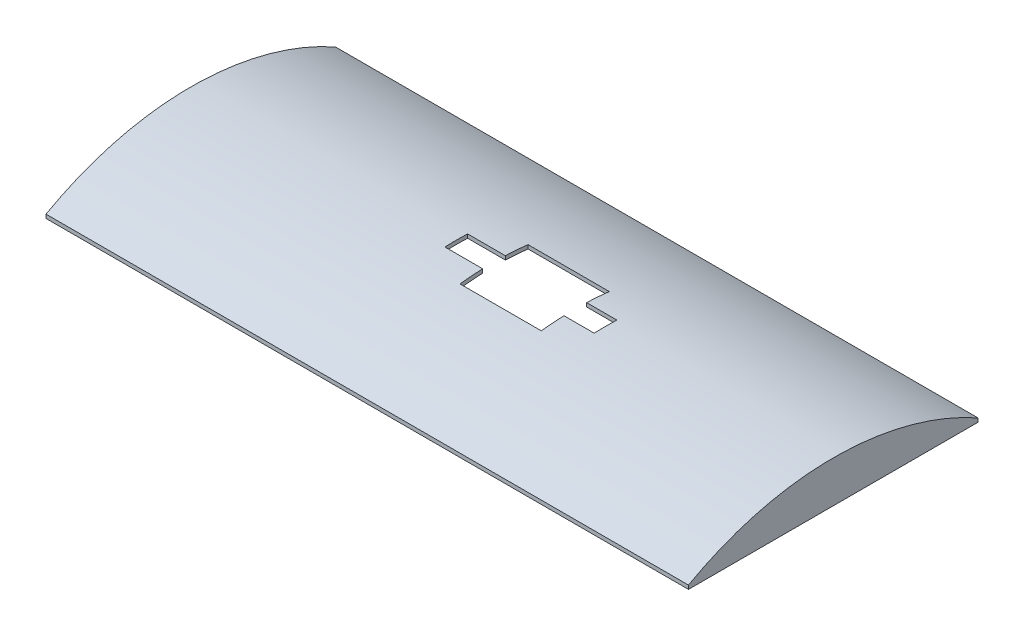
ISO-10303-21;
HEADER;
FILE_DESCRIPTION(('STEP AP214'),'2;1');
FILE_NAME('part.step','',(''),(''),'','','');
FILE_SCHEMA(('AUTOMOTIVE_DESIGN { 1 0 10303 214 1 1 1 1 }'));
ENDSEC;
DATA;
#1=APPLICATION_CONTEXT('core data for automotive mechanical design processes');
#2=APPLICATION_PROTOCOL_DEFINITION('international standard','automotive_design',2000,#1);
#3=PRODUCT_CONTEXT('',#1,'mechanical');
#4=PRODUCT('Part','Part','',(#3));
#5=PRODUCT_RELATED_PRODUCT_CATEGORY('part','',(#4));
#6=PRODUCT_DEFINITION_FORMATION('','',#4);
#7=PRODUCT_DEFINITION_CONTEXT('part definition',#1,'design');
#8=PRODUCT_DEFINITION('design','',#6,#7);
#9=PRODUCT_DEFINITION_SHAPE('','',#8);
#10=(LENGTH_UNIT() NAMED_UNIT(*) SI_UNIT(.MILLI.,.METRE.));
#11=(NAMED_UNIT(*) PLANE_ANGLE_UNIT() SI_UNIT($,.RADIAN.));
#12=(NAMED_UNIT(*) SI_UNIT($,.STERADIAN.) SOLID_ANGLE_UNIT());
#13=UNCERTAINTY_MEASURE_WITH_UNIT(LENGTH_MEASURE(1.E-05),#10,'distance_accuracy_value','');
#14=(GEOMETRIC_REPRESENTATION_CONTEXT(3) GLOBAL_UNCERTAINTY_ASSIGNED_CONTEXT((#13)) GLOBAL_UNIT_ASSIGNED_CONTEXT((#10,
#11,#12)) REPRESENTATION_CONTEXT('',''));
#15=CARTESIAN_POINT('',(0.,0.,0.));
#16=DIRECTION('',(0.,0.,1.));
#17=DIRECTION('',(1.,0.,0.));
#18=AXIS2_PLACEMENT_3D('',#15,#16,#17);
#19=CARTESIAN_POINT('',(-50.,-78.359,3.874307259704E-13));
#20=DIRECTION('',(1.,0.,0.));
#21=DIRECTION('',(0.,0.,-1.));
#22=AXIS2_PLACEMENT_3D('',#19,#20,#21);
#23=CYLINDRICAL_SURFACE('',#22,78.359);
#24=DIRECTION('',(1.,0.,0.));
#25=VECTOR('',#24,1.);
#26=CARTESIAN_POINT('',(-50.,-9.99999999999999,38.3037857136859));
#27=LINE('',#26,#25);
#28=CARTESIAN_POINT('',(-50.,-9.99999999999999,38.3037857136859));
#29=VERTEX_POINT('',#28);
#30=CARTESIAN_POINT('',(120.,-9.99999999999999,38.3037857136859));
#31=VERTEX_POINT('',#30);
#32=EDGE_CURVE('E179',#29,#31,#27,.T.);
#33=ORIENTED_EDGE('',*,*,#32,.T.);
#34=CARTESIAN_POINT('',(120.,-78.359,3.874307259704E-13));
#35=DIRECTION('',(-1.,0.,0.));
#36=DIRECTION('',(0.,0.,1.));
#37=AXIS2_PLACEMENT_3D('',#34,#35,#36);
#38=CIRCLE('',#37,78.359);
#39=CARTESIAN_POINT('',(120.,-9.99999999999999,-38.3037857136859));
#40=VERTEX_POINT('',#39);
#41=EDGE_CURVE('E224',#31,#40,#38,.T.);
#42=ORIENTED_EDGE('',*,*,#41,.T.);
#43=DIRECTION('',(1.,0.,0.));
#44=VECTOR('',#43,1.);
#45=CARTESIAN_POINT('',(-50.,-9.99999999999999,-38.3037857136859));
#46=LINE('',#45,#44);
#47=CARTESIAN_POINT('',(-50.,-9.99999999999999,-38.3037857136859));
#48=VERTEX_POINT('',#47);
#49=EDGE_CURVE('E219',#48,#40,#46,.T.);
#50=ORIENTED_EDGE('',*,*,#49,.F.);
#51=CARTESIAN_POINT('',(-50.,-78.359,3.874307259704E-13));
#52=DIRECTION('',(-1.,0.,0.));
#53=DIRECTION('',(0.,0.,1.));
#54=AXIS2_PLACEMENT_3D('',#51,#52,#53);
#55=CIRCLE('',#54,78.359);
#56=EDGE_CURVE('E222',#29,#48,#55,.T.);
#57=ORIENTED_EDGE('',*,*,#56,.F.);
#58=EDGE_LOOP('',(#33,#42,#50,#57));
#59=FACE_BOUND('',#58,.T.);
#60=CARTESIAN_POINT('',(20.25,-78.359,3.874307259704E-13));
#61=DIRECTION('',(1.,0.,0.));
#62=DIRECTION('',(0.,0.,-1.));
#63=AXIS2_PLACEMENT_3D('',#60,#61,#62);
#64=CIRCLE('',#63,78.359);
#65=CARTESIAN_POINT('',(20.25,-0.0574490511203313,-2.99999999999993));
#66=VERTEX_POINT('',#65);
#67=CARTESIAN_POINT('',(20.25,-0.0574490511203174,3.00000000000007));
#68=VERTEX_POINT('',#67);
#69=EDGE_CURVE('E298',#66,#68,#64,.T.);
#70=ORIENTED_EDGE('',*,*,#69,.F.);
#71=DIRECTION('',(1.,0.,0.));
#72=VECTOR('',#71,1.);
#73=CARTESIAN_POINT('',(-50.,-0.0574490511203313,-2.99999999999993));
#74=LINE('',#73,#72);
#75=CARTESIAN_POINT('',(30.25,-0.0574490511203313,-2.99999999999993));
#76=VERTEX_POINT('',#75);
#77=EDGE_CURVE('E300',#76,#66,#74,.F.);
#78=ORIENTED_EDGE('',*,*,#77,.F.);
#79=CARTESIAN_POINT('',(30.25,-78.359,3.874307259704E-13));
#80=DIRECTION('',(-1.,0.,0.));
#81=DIRECTION('',(0.,0.,1.));
#82=AXIS2_PLACEMENT_3D('',#79,#80,#81);
#83=CIRCLE('',#82,78.359);
#84=CARTESIAN_POINT('',(30.25,-0.518567826225461,-8.99999999999993));
#85=VERTEX_POINT('',#84);
#86=EDGE_CURVE('E302',#76,#85,#83,.T.);
#87=ORIENTED_EDGE('',*,*,#86,.T.);
#88=DIRECTION('',(1.,0.,0.));
#89=VECTOR('',#88,1.);
#90=CARTESIAN_POINT('',(-50.,-0.518567826225461,-8.99999999999993));
#91=LINE('',#90,#89);
#92=CARTESIAN_POINT('',(51.75,-0.518567826225461,-8.99999999999994));
#93=VERTEX_POINT('',#92);
#94=EDGE_CURVE('E186',#93,#85,#91,.F.);
#95=ORIENTED_EDGE('',*,*,#94,.F.);
#96=CARTESIAN_POINT('',(51.75,-78.359,3.874307259704E-13));
#97=DIRECTION('',(-1.,0.,0.));
#98=DIRECTION('',(0.,0.,1.));
#99=AXIS2_PLACEMENT_3D('',#96,#97,#98);
#100=CIRCLE('',#99,78.359);
#101=CARTESIAN_POINT('',(51.75,-0.0574490511203313,-2.99999999999994));
#102=VERTEX_POINT('',#101);
#103=EDGE_CURVE('E277',#102,#93,#100,.T.);
#104=ORIENTED_EDGE('',*,*,#103,.F.);
#105=DIRECTION('',(1.,0.,0.));
#106=VECTOR('',#105,1.);
#107=CARTESIAN_POINT('',(-50.,-0.0574490511203313,-2.99999999999994));
#108=LINE('',#107,#106);
#109=CARTESIAN_POINT('',(59.75,-0.0574490511203313,-2.99999999999994));
#110=VERTEX_POINT('',#109);
#111=EDGE_CURVE('E279',#102,#110,#108,.T.);
#112=ORIENTED_EDGE('',*,*,#111,.T.);
#113=CARTESIAN_POINT('',(59.75,-78.359,3.874307259704E-13));
#114=DIRECTION('',(1.,0.,0.));
#115=DIRECTION('',(0.,0.,-1.));
#116=AXIS2_PLACEMENT_3D('',#113,#114,#115);
#117=CIRCLE('',#116,78.359);
#118=CARTESIAN_POINT('',(59.75,-0.0574490511203174,3.00000000000006));
#119=VERTEX_POINT('',#118);
#120=EDGE_CURVE('E282',#110,#119,#117,.T.);
#121=ORIENTED_EDGE('',*,*,#120,.T.);
#122=DIRECTION('',(1.,0.,0.));
#123=VECTOR('',#122,1.);
#124=CARTESIAN_POINT('',(-50.,-0.0574490511203174,3.00000000000006));
#125=LINE('',#124,#123);
#126=CARTESIAN_POINT('',(51.75,-0.0574490511203174,3.00000000000006));
#127=VERTEX_POINT('',#126);
#128=EDGE_CURVE('E284',#127,#119,#125,.T.);
#129=ORIENTED_EDGE('',*,*,#128,.F.);
#130=CARTESIAN_POINT('',(51.75,-78.359,3.874307259704E-13));
#131=DIRECTION('',(-1.,0.,0.));
#132=DIRECTION('',(0.,0.,1.));
#133=AXIS2_PLACEMENT_3D('',#130,#131,#132);
#134=CIRCLE('',#133,78.359);
#135=CARTESIAN_POINT('',(51.75,-0.518567826225391,9.00000000000006));
#136=VERTEX_POINT('',#135);
#137=EDGE_CURVE('E287',#136,#127,#134,.T.);
#138=ORIENTED_EDGE('',*,*,#137,.F.);
#139=DIRECTION('',(1.,0.,0.));
#140=VECTOR('',#139,1.);
#141=CARTESIAN_POINT('',(-50.,-0.518567826225391,9.00000000000007));
#142=LINE('',#141,#140);
#143=CARTESIAN_POINT('',(30.25,-0.518567826225391,9.00000000000007));
#144=VERTEX_POINT('',#143);
#145=EDGE_CURVE('E289',#136,#144,#142,.F.);
#146=ORIENTED_EDGE('',*,*,#145,.T.);
#147=CARTESIAN_POINT('',(30.25,-78.359,3.874307259704E-13));
#148=DIRECTION('',(-1.,0.,0.));
#149=DIRECTION('',(0.,0.,1.));
#150=AXIS2_PLACEMENT_3D('',#147,#148,#149);
#151=CIRCLE('',#150,78.359);
#152=CARTESIAN_POINT('',(30.25,-0.0574490511203174,3.00000000000007));
#153=VERTEX_POINT('',#152);
#154=EDGE_CURVE('E292',#144,#153,#151,.T.);
#155=ORIENTED_EDGE('',*,*,#154,.T.);
#156=DIRECTION('',(1.,0.,0.));
#157=VECTOR('',#156,1.);
#158=CARTESIAN_POINT('',(-50.,-0.0574490511203174,3.00000000000007));
#159=LINE('',#158,#157);
#160=EDGE_CURVE('E295',#153,#68,#159,.F.);
#161=ORIENTED_EDGE('',*,*,#160,.T.);
#162=EDGE_LOOP('',(#70,#78,#87,#95,#104,#112,#121,#129,#138,#146,#155,#161));
#163=FACE_BOUND('',#162,.T.);
#164=ADVANCED_FACE('F41',(#59,#163),#23,.T.);
#165=CARTESIAN_POINT('',(-50.,-78.359,3.874307259704E-13));
#166=DIRECTION('',(1.,0.,0.));
#167=DIRECTION('',(0.,0.,-1.));
#168=AXIS2_PLACEMENT_3D('',#165,#166,#167);
#169=CYLINDRICAL_SURFACE('',#168,77.359);
#170=DIRECTION('',(1.,0.,0.));
#171=VECTOR('',#170,1.);
#172=CARTESIAN_POINT('',(-49.,-9.99999999999999,36.2141132709338));
#173=LINE('',#172,#171);
#174=CARTESIAN_POINT('',(-49.,-9.99999999999999,36.2141132709338));
#175=VERTEX_POINT('',#174);
#176=CARTESIAN_POINT('',(119.,-9.99999999999999,36.2141132709338));
#177=VERTEX_POINT('',#176);
#178=EDGE_CURVE('E226',#175,#177,#173,.T.);
#179=ORIENTED_EDGE('',*,*,#178,.F.);
#180=CARTESIAN_POINT('',(-49.,-78.359,3.874307259704E-13));
#181=DIRECTION('',(-1.,0.,0.));
#182=DIRECTION('',(0.,0.,1.));
#183=AXIS2_PLACEMENT_3D('',#180,#181,#182);
#184=CIRCLE('',#183,77.359);
#185=CARTESIAN_POINT('',(-49.,-9.99999999999999,-36.2141132709331));
#186=VERTEX_POINT('',#185);
#187=EDGE_CURVE('E230',#175,#186,#184,.T.);
#188=ORIENTED_EDGE('',*,*,#187,.T.);
#189=DIRECTION('',(1.,0.,0.));
#190=VECTOR('',#189,1.);
#191=CARTESIAN_POINT('',(-49.,-9.99999999999999,-36.2141132709331));
#192=LINE('',#191,#190);
#193=CARTESIAN_POINT('',(119.,-9.99999999999999,-36.2141132709331));
#194=VERTEX_POINT('',#193);
#195=EDGE_CURVE('E227',#186,#194,#192,.T.);
#196=ORIENTED_EDGE('',*,*,#195,.T.);
#197=CARTESIAN_POINT('',(119.,-78.359,3.874307259704E-13));
#198=DIRECTION('',(-1.,0.,0.));
#199=DIRECTION('',(0.,0.,1.));
#200=AXIS2_PLACEMENT_3D('',#197,#198,#199);
#201=CIRCLE('',#200,77.359);
#202=EDGE_CURVE('E235',#177,#194,#201,.T.);
#203=ORIENTED_EDGE('',*,*,#202,.F.);
#204=EDGE_LOOP('',(#179,#188,#196,#203));
#205=FACE_BOUND('',#204,.T.);
#206=CARTESIAN_POINT('',(51.75,-78.359,3.874307259704E-13));
#207=DIRECTION('',(-1.,0.,0.));
#208=DIRECTION('',(0.,0.,1.));
#209=AXIS2_PLACEMENT_3D('',#206,#207,#208);
#210=CIRCLE('',#209,77.359);
#211=CARTESIAN_POINT('',(51.75,-1.05819223578579,-2.99999999999995));
#212=VERTEX_POINT('',#211);
#213=CARTESIAN_POINT('',(51.75,-1.52531675495444,-8.99999999999994));
#214=VERTEX_POINT('',#213);
#215=EDGE_CURVE('E48',#212,#214,#210,.T.);
#216=ORIENTED_EDGE('',*,*,#215,.T.);
#217=DIRECTION('',(1.,0.,0.));
#218=VECTOR('',#217,1.);
#219=CARTESIAN_POINT('',(-50.,-1.52531675495444,-8.99999999999994));
#220=LINE('',#219,#218);
#221=CARTESIAN_POINT('',(30.25,-1.52531675495444,-8.99999999999994));
#222=VERTEX_POINT('',#221);
#223=EDGE_CURVE('E11',#214,#222,#220,.F.);
#224=ORIENTED_EDGE('',*,*,#223,.T.);
#225=CARTESIAN_POINT('',(30.25,-78.359,3.874307259704E-13));
#226=DIRECTION('',(-1.,0.,0.));
#227=DIRECTION('',(0.,0.,1.));
#228=AXIS2_PLACEMENT_3D('',#225,#226,#227);
#229=CIRCLE('',#228,77.359);
#230=CARTESIAN_POINT('',(30.25,-1.05819223578579,-2.99999999999993));
#231=VERTEX_POINT('',#230);
#232=EDGE_CURVE('E174',#231,#222,#229,.T.);
#233=ORIENTED_EDGE('',*,*,#232,.F.);
#234=DIRECTION('',(1.,0.,0.));
#235=VECTOR('',#234,1.);
#236=CARTESIAN_POINT('',(-50.,-1.05819223578579,-2.99999999999993));
#237=LINE('',#236,#235);
#238=CARTESIAN_POINT('',(20.25,-1.05819223578579,-2.99999999999993));
#239=VERTEX_POINT('',#238);
#240=EDGE_CURVE('E178',#231,#239,#237,.F.);
#241=ORIENTED_EDGE('',*,*,#240,.T.);
#242=CARTESIAN_POINT('',(20.25,-78.359,3.874307259704E-13));
#243=DIRECTION('',(1.,0.,0.));
#244=DIRECTION('',(0.,0.,-1.));
#245=AXIS2_PLACEMENT_3D('',#242,#243,#244);
#246=CIRCLE('',#245,77.359);
#247=CARTESIAN_POINT('',(20.25,-1.05819223578578,3.00000000000007));
#248=VERTEX_POINT('',#247);
#249=EDGE_CURVE('E213',#239,#248,#246,.T.);
#250=ORIENTED_EDGE('',*,*,#249,.T.);
#251=DIRECTION('',(1.,0.,0.));
#252=VECTOR('',#251,1.);
#253=CARTESIAN_POINT('',(-50.,-1.05819223578578,3.00000000000007));
#254=LINE('',#253,#252);
#255=CARTESIAN_POINT('',(30.25,-1.05819223578578,3.00000000000007));
#256=VERTEX_POINT('',#255);
#257=EDGE_CURVE('E211',#256,#248,#254,.F.);
#258=ORIENTED_EDGE('',*,*,#257,.F.);
#259=CARTESIAN_POINT('',(30.25,-78.359,3.874307259704E-13));
#260=DIRECTION('',(-1.,0.,0.));
#261=DIRECTION('',(0.,0.,1.));
#262=AXIS2_PLACEMENT_3D('',#259,#260,#261);
#263=CIRCLE('',#262,77.359);
#264=CARTESIAN_POINT('',(30.25,-1.52531675495438,9.00000000000006));
#265=VERTEX_POINT('',#264);
#266=EDGE_CURVE('E209',#265,#256,#263,.T.);
#267=ORIENTED_EDGE('',*,*,#266,.F.);
#268=DIRECTION('',(1.,0.,0.));
#269=VECTOR('',#268,1.);
#270=CARTESIAN_POINT('',(-50.,-1.52531675495438,9.00000000000006));
#271=LINE('',#270,#269);
#272=CARTESIAN_POINT('',(51.75,-1.52531675495438,9.00000000000005));
#273=VERTEX_POINT('',#272);
#274=EDGE_CURVE('E207',#273,#265,#271,.F.);
#275=ORIENTED_EDGE('',*,*,#274,.F.);
#276=CARTESIAN_POINT('',(51.75,-78.359,3.874307259704E-13));
#277=DIRECTION('',(-1.,0.,0.));
#278=DIRECTION('',(0.,0.,1.));
#279=AXIS2_PLACEMENT_3D('',#276,#277,#278);
#280=CIRCLE('',#279,77.359);
#281=CARTESIAN_POINT('',(51.75,-1.05819223578578,3.00000000000005));
#282=VERTEX_POINT('',#281);
#283=EDGE_CURVE('E204',#273,#282,#280,.T.);
#284=ORIENTED_EDGE('',*,*,#283,.T.);
#285=DIRECTION('',(1.,0.,0.));
#286=VECTOR('',#285,1.);
#287=CARTESIAN_POINT('',(-50.,-1.05819223578578,3.00000000000005));
#288=LINE('',#287,#286);
#289=CARTESIAN_POINT('',(59.75,-1.05819223578578,3.00000000000005));
#290=VERTEX_POINT('',#289);
#291=EDGE_CURVE('E201',#282,#290,#288,.T.);
#292=ORIENTED_EDGE('',*,*,#291,.T.);
#293=CARTESIAN_POINT('',(59.75,-78.359,3.874307259704E-13));
#294=DIRECTION('',(1.,0.,0.));
#295=DIRECTION('',(0.,0.,-1.));
#296=AXIS2_PLACEMENT_3D('',#293,#294,#295);
#297=CIRCLE('',#296,77.359);
#298=CARTESIAN_POINT('',(59.75,-1.05819223578579,-2.99999999999995));
#299=VERTEX_POINT('',#298);
#300=EDGE_CURVE('E197',#299,#290,#297,.T.);
#301=ORIENTED_EDGE('',*,*,#300,.F.);
#302=DIRECTION('',(1.,0.,0.));
#303=VECTOR('',#302,1.);
#304=CARTESIAN_POINT('',(-50.,-1.05819223578579,-2.99999999999995));
#305=LINE('',#304,#303);
#306=EDGE_CURVE('E193',#212,#299,#305,.T.);
#307=ORIENTED_EDGE('',*,*,#306,.F.);
#308=EDGE_LOOP('',(#216,#224,#233,#241,#250,#258,#267,#275,#284,#292,#301,#307));
#309=FACE_BOUND('',#308,.T.);
#310=ADVANCED_FACE('F190',(#205,#309),#169,.F.);
#311=CARTESIAN_POINT('',(-50.,0.,0.));
#312=DIRECTION('',(-1.,0.,0.));
#313=DIRECTION('',(0.,0.,1.));
#314=AXIS2_PLACEMENT_3D('',#311,#312,#313);
#315=PLANE('',#314);
#316=DIRECTION('',(0.,1.,0.));
#317=VECTOR('',#316,1.);
#318=CARTESIAN_POINT('',(-50.,-11.,-38.3037857136859));
#319=LINE('',#318,#317);
#320=CARTESIAN_POINT('',(-50.,-11.,-38.3037857136859));
#321=VERTEX_POINT('',#320);
#322=EDGE_CURVE('E238',#321,#48,#319,.T.);
#323=ORIENTED_EDGE('',*,*,#322,.F.);
#324=DIRECTION('',(0.,0.,-1.));
#325=VECTOR('',#324,1.);
#326=CARTESIAN_POINT('',(-50.,-11.,0.));
#327=LINE('',#326,#325);
#328=CARTESIAN_POINT('',(-50.,-11.,38.3037857136859));
#329=VERTEX_POINT('',#328);
#330=EDGE_CURVE('E265',#329,#321,#327,.T.);
#331=ORIENTED_EDGE('',*,*,#330,.F.);
#332=DIRECTION('',(0.,1.,0.));
#333=VECTOR('',#332,1.);
#334=CARTESIAN_POINT('',(-50.,-11.,38.3037857136859));
#335=LINE('',#334,#333);
#336=EDGE_CURVE('E241',#329,#29,#335,.T.);
#337=ORIENTED_EDGE('',*,*,#336,.T.);
#338=ORIENTED_EDGE('',*,*,#56,.T.);
#339=EDGE_LOOP('',(#323,#331,#337,#338));
#340=FACE_BOUND('',#339,.T.);
#341=ADVANCED_FACE('F383',(#340),#315,.T.);
#342=CARTESIAN_POINT('',(120.,0.,0.));
#343=DIRECTION('',(-1.,0.,0.));
#344=DIRECTION('',(0.,0.,1.));
#345=AXIS2_PLACEMENT_3D('',#342,#343,#344);
#346=PLANE('',#345);
#347=DIRECTION('',(0.,1.,0.));
#348=VECTOR('',#347,1.);
#349=CARTESIAN_POINT('',(120.,-11.,38.3037857136859));
#350=LINE('',#349,#348);
#351=CARTESIAN_POINT('',(120.,-11.,38.3037857136859));
#352=VERTEX_POINT('',#351);
#353=EDGE_CURVE('E255',#352,#31,#350,.T.);
#354=ORIENTED_EDGE('',*,*,#353,.F.);
#355=DIRECTION('',(0.,0.,1.));
#356=VECTOR('',#355,1.);
#357=CARTESIAN_POINT('',(120.,-11.,0.));
#358=LINE('',#357,#356);
#359=CARTESIAN_POINT('',(120.,-11.,-38.3037857136859));
#360=VERTEX_POINT('',#359);
#361=EDGE_CURVE('E261',#360,#352,#358,.T.);
#362=ORIENTED_EDGE('',*,*,#361,.F.);
#363=DIRECTION('',(0.,1.,0.));
#364=VECTOR('',#363,1.);
#365=CARTESIAN_POINT('',(120.,-11.,-38.3037857136859));
#366=LINE('',#365,#364);
#367=EDGE_CURVE('E252',#360,#40,#366,.T.);
#368=ORIENTED_EDGE('',*,*,#367,.T.);
#369=ORIENTED_EDGE('',*,*,#41,.F.);
#370=EDGE_LOOP('',(#354,#362,#368,#369));
#371=FACE_BOUND('',#370,.T.);
#372=ADVANCED_FACE('F395',(#371),#346,.F.);
#373=CARTESIAN_POINT('',(0.,-11.,-38.3037857136859));
#374=DIRECTION('',(0.,0.,1.));
#375=DIRECTION('',(1.,0.,0.));
#376=AXIS2_PLACEMENT_3D('',#373,#374,#375);
#377=PLANE('',#376);
#378=ORIENTED_EDGE('',*,*,#49,.T.);
#379=ORIENTED_EDGE('',*,*,#367,.F.);
#380=DIRECTION('',(1.,0.,0.));
#381=VECTOR('',#380,1.);
#382=CARTESIAN_POINT('',(0.,-11.,-38.3037857136859));
#383=LINE('',#382,#381);
#384=EDGE_CURVE('E263',#321,#360,#383,.T.);
#385=ORIENTED_EDGE('',*,*,#384,.F.);
#386=ORIENTED_EDGE('',*,*,#322,.T.);
#387=EDGE_LOOP('',(#378,#379,#385,#386));
#388=FACE_BOUND('',#387,.T.);
#389=ADVANCED_FACE('F399',(#388),#377,.F.);
#390=CARTESIAN_POINT('',(0.,-11.,-36.2141132709331));
#391=DIRECTION('',(0.,0.,-1.));
#392=DIRECTION('',(-1.,0.,0.));
#393=AXIS2_PLACEMENT_3D('',#390,#391,#392);
#394=PLANE('',#393);
#395=ORIENTED_EDGE('',*,*,#195,.F.);
#396=DIRECTION('',(0.,1.,0.));
#397=VECTOR('',#396,1.);
#398=CARTESIAN_POINT('',(-49.,-11.,-36.2141132709331));
#399=LINE('',#398,#397);
#400=CARTESIAN_POINT('',(-49.,-11.,-36.2141132709331));
#401=VERTEX_POINT('',#400);
#402=EDGE_CURVE('E242',#401,#186,#399,.T.);
#403=ORIENTED_EDGE('',*,*,#402,.F.);
#404=DIRECTION('',(-1.,0.,0.));
#405=VECTOR('',#404,1.);
#406=CARTESIAN_POINT('',(0.,-11.,-36.2141132709331));
#407=LINE('',#406,#405);
#408=CARTESIAN_POINT('',(119.,-11.,-36.2141132709331));
#409=VERTEX_POINT('',#408);
#410=EDGE_CURVE('E271',#409,#401,#407,.T.);
#411=ORIENTED_EDGE('',*,*,#410,.F.);
#412=DIRECTION('',(0.,1.,0.));
#413=VECTOR('',#412,1.);
#414=CARTESIAN_POINT('',(119.,-11.,-36.2141132709331));
#415=LINE('',#414,#413);
#416=EDGE_CURVE('E239',#409,#194,#415,.T.);
#417=ORIENTED_EDGE('',*,*,#416,.T.);
#418=EDGE_LOOP('',(#395,#403,#411,#417));
#419=FACE_BOUND('',#418,.T.);
#420=ADVANCED_FACE('F420',(#419),#394,.F.);
#421=CARTESIAN_POINT('',(0.,-11.,36.2141132709338));
#422=DIRECTION('',(0.,0.,1.));
#423=DIRECTION('',(1.,0.,0.));
#424=AXIS2_PLACEMENT_3D('',#421,#422,#423);
#425=PLANE('',#424);
#426=ORIENTED_EDGE('',*,*,#178,.T.);
#427=DIRECTION('',(0.,1.,0.));
#428=VECTOR('',#427,1.);
#429=CARTESIAN_POINT('',(119.,-11.,36.2141132709338));
#430=LINE('',#429,#428);
#431=CARTESIAN_POINT('',(119.,-11.,36.2141132709338));
#432=VERTEX_POINT('',#431);
#433=EDGE_CURVE('E247',#432,#177,#430,.T.);
#434=ORIENTED_EDGE('',*,*,#433,.F.);
#435=DIRECTION('',(1.,0.,0.));
#436=VECTOR('',#435,1.);
#437=CARTESIAN_POINT('',(0.,-11.,36.2141132709338));
#438=LINE('',#437,#436);
#439=CARTESIAN_POINT('',(-49.,-11.,36.2141132709338));
#440=VERTEX_POINT('',#439);
#441=EDGE_CURVE('E267',#440,#432,#438,.T.);
#442=ORIENTED_EDGE('',*,*,#441,.F.);
#443=DIRECTION('',(0.,1.,0.));
#444=VECTOR('',#443,1.);
#445=CARTESIAN_POINT('',(-49.,-11.,36.2141132709338));
#446=LINE('',#445,#444);
#447=EDGE_CURVE('E245',#440,#175,#446,.T.);
#448=ORIENTED_EDGE('',*,*,#447,.T.);
#449=EDGE_LOOP('',(#426,#434,#442,#448));
#450=FACE_BOUND('',#449,.T.);
#451=ADVANCED_FACE('F415',(#450),#425,.F.);
#452=CARTESIAN_POINT('',(0.,-11.,38.3037857136859));
#453=DIRECTION('',(0.,0.,-1.));
#454=DIRECTION('',(-1.,0.,0.));
#455=AXIS2_PLACEMENT_3D('',#452,#453,#454);
#456=PLANE('',#455);
#457=ORIENTED_EDGE('',*,*,#32,.F.);
#458=ORIENTED_EDGE('',*,*,#336,.F.);
#459=DIRECTION('',(-1.,0.,0.));
#460=VECTOR('',#459,1.);
#461=CARTESIAN_POINT('',(0.,-11.,38.3037857136859));
#462=LINE('',#461,#460);
#463=EDGE_CURVE('E249',#352,#329,#462,.T.);
#464=ORIENTED_EDGE('',*,*,#463,.F.);
#465=ORIENTED_EDGE('',*,*,#353,.T.);
#466=EDGE_LOOP('',(#457,#458,#464,#465));
#467=FACE_BOUND('',#466,.T.);
#468=ADVANCED_FACE('F392',(#467),#456,.F.);
#469=CARTESIAN_POINT('',(0.,-11.,0.));
#470=DIRECTION('',(0.,-1.,0.));
#471=DIRECTION('',(0.,0.,-1.));
#472=AXIS2_PLACEMENT_3D('',#469,#470,#471);
#473=PLANE('',#472);
#474=ORIENTED_EDGE('',*,*,#410,.T.);
#475=DIRECTION('',(0.,0.,1.));
#476=VECTOR('',#475,1.);
#477=CARTESIAN_POINT('',(-49.,-11.,0.));
#478=LINE('',#477,#476);
#479=EDGE_CURVE('E269',#401,#440,#478,.T.);
#480=ORIENTED_EDGE('',*,*,#479,.T.);
#481=ORIENTED_EDGE('',*,*,#441,.T.);
#482=DIRECTION('',(0.,0.,-1.));
#483=VECTOR('',#482,1.);
#484=CARTESIAN_POINT('',(119.,-11.,0.));
#485=LINE('',#484,#483);
#486=EDGE_CURVE('E273',#432,#409,#485,.T.);
#487=ORIENTED_EDGE('',*,*,#486,.T.);
#488=EDGE_LOOP('',(#474,#480,#481,#487));
#489=FACE_BOUND('',#488,.T.);
#490=ORIENTED_EDGE('',*,*,#330,.T.);
#491=ORIENTED_EDGE('',*,*,#384,.T.);
#492=ORIENTED_EDGE('',*,*,#361,.T.);
#493=ORIENTED_EDGE('',*,*,#463,.T.);
#494=EDGE_LOOP('',(#490,#491,#492,#493));
#495=FACE_BOUND('',#494,.T.);
#496=ADVANCED_FACE('F404',(#489,#495),#473,.T.);
#497=CARTESIAN_POINT('',(119.,0.,0.));
#498=DIRECTION('',(-1.,0.,0.));
#499=DIRECTION('',(0.,0.,1.));
#500=AXIS2_PLACEMENT_3D('',#497,#498,#499);
#501=PLANE('',#500);
#502=ORIENTED_EDGE('',*,*,#202,.T.);
#503=ORIENTED_EDGE('',*,*,#416,.F.);
#504=ORIENTED_EDGE('',*,*,#486,.F.);
#505=ORIENTED_EDGE('',*,*,#433,.T.);
#506=EDGE_LOOP('',(#502,#503,#504,#505));
#507=FACE_BOUND('',#506,.T.);
#508=ADVANCED_FACE('F405',(#507),#501,.T.);
#509=CARTESIAN_POINT('',(-49.,0.,0.));
#510=DIRECTION('',(-1.,0.,0.));
#511=DIRECTION('',(0.,0.,1.));
#512=AXIS2_PLACEMENT_3D('',#509,#510,#511);
#513=PLANE('',#512);
#514=ORIENTED_EDGE('',*,*,#187,.F.);
#515=ORIENTED_EDGE('',*,*,#447,.F.);
#516=ORIENTED_EDGE('',*,*,#479,.F.);
#517=ORIENTED_EDGE('',*,*,#402,.T.);
#518=EDGE_LOOP('',(#514,#515,#516,#517));
#519=FACE_BOUND('',#518,.T.);
#520=ADVANCED_FACE('F375',(#519),#513,.F.);
#521=CARTESIAN_POINT('',(0.,-11.0000000000002,-9.));
#522=DIRECTION('',(0.,0.,1.));
#523=DIRECTION('',(0.,-1.,0.));
#524=AXIS2_PLACEMENT_3D('',#521,#522,#523);
#525=PLANE('',#524);
#526=ORIENTED_EDGE('',*,*,#94,.T.);
#527=DIRECTION('',(0.,1.,0.));
#528=VECTOR('',#527,1.);
#529=CARTESIAN_POINT('',(30.25,-11.0000000000002,-9.));
#530=LINE('',#529,#528);
#531=EDGE_CURVE('E55',#222,#85,#530,.T.);
#532=ORIENTED_EDGE('',*,*,#531,.F.);
#533=ORIENTED_EDGE('',*,*,#223,.F.);
#534=DIRECTION('',(0.,1.,0.));
#535=VECTOR('',#534,1.);
#536=CARTESIAN_POINT('',(51.75,-11.0000000000002,-9.00000000000001));
#537=LINE('',#536,#535);
#538=EDGE_CURVE('E304',#214,#93,#537,.T.);
#539=ORIENTED_EDGE('',*,*,#538,.T.);
#540=EDGE_LOOP('',(#526,#532,#533,#539));
#541=FACE_BOUND('',#540,.T.);
#542=ADVANCED_FACE('F182',(#541),#525,.T.);
#543=CARTESIAN_POINT('',(51.75,-11.0000000000003,0.));
#544=DIRECTION('',(-1.,0.,0.));
#545=DIRECTION('',(0.,0.,1.));
#546=AXIS2_PLACEMENT_3D('',#543,#544,#545);
#547=PLANE('',#546);
#548=ORIENTED_EDGE('',*,*,#103,.T.);
#549=ORIENTED_EDGE('',*,*,#538,.F.);
#550=ORIENTED_EDGE('',*,*,#215,.F.);
#551=DIRECTION('',(0.,1.,0.));
#552=VECTOR('',#551,1.);
#553=CARTESIAN_POINT('',(51.75,-11.0000000000002,-3.00000000000002));
#554=LINE('',#553,#552);
#555=EDGE_CURVE('E306',#212,#102,#554,.T.);
#556=ORIENTED_EDGE('',*,*,#555,.T.);
#557=EDGE_LOOP('',(#548,#549,#550,#556));
#558=FACE_BOUND('',#557,.T.);
#559=ADVANCED_FACE('F367',(#558),#547,.T.);
#560=CARTESIAN_POINT('',(0.,-11.0000000000002,-3.00000000000002));
#561=DIRECTION('',(0.,0.,-1.));
#562=DIRECTION('',(0.,1.,0.));
#563=AXIS2_PLACEMENT_3D('',#560,#561,#562);
#564=PLANE('',#563);
#565=ORIENTED_EDGE('',*,*,#555,.F.);
#566=ORIENTED_EDGE('',*,*,#306,.T.);
#567=DIRECTION('',(0.,1.,0.));
#568=VECTOR('',#567,1.);
#569=CARTESIAN_POINT('',(59.75,-11.0000000000002,-3.00000000000002));
#570=LINE('',#569,#568);
#571=EDGE_CURVE('E308',#299,#110,#570,.T.);
#572=ORIENTED_EDGE('',*,*,#571,.T.);
#573=ORIENTED_EDGE('',*,*,#111,.F.);
#574=EDGE_LOOP('',(#565,#566,#572,#573));
#575=FACE_BOUND('',#574,.T.);
#576=ADVANCED_FACE('F365',(#575),#564,.F.);
#577=CARTESIAN_POINT('',(59.75,-11.0000000000003,0.));
#578=DIRECTION('',(1.,0.,0.));
#579=DIRECTION('',(0.,0.,-1.));
#580=AXIS2_PLACEMENT_3D('',#577,#578,#579);
#581=PLANE('',#580);
#582=ORIENTED_EDGE('',*,*,#571,.F.);
#583=ORIENTED_EDGE('',*,*,#300,.T.);
#584=DIRECTION('',(0.,1.,0.));
#585=VECTOR('',#584,1.);
#586=CARTESIAN_POINT('',(59.75,-11.0000000000003,2.99999999999998));
#587=LINE('',#586,#585);
#588=EDGE_CURVE('E311',#290,#119,#587,.T.);
#589=ORIENTED_EDGE('',*,*,#588,.T.);
#590=ORIENTED_EDGE('',*,*,#120,.F.);
#591=EDGE_LOOP('',(#582,#583,#589,#590));
#592=FACE_BOUND('',#591,.T.);
#593=ADVANCED_FACE('F363',(#592),#581,.F.);
#594=CARTESIAN_POINT('',(0.,-11.0000000000003,2.99999999999998));
#595=DIRECTION('',(0.,0.,-1.));
#596=DIRECTION('',(0.,1.,0.));
#597=AXIS2_PLACEMENT_3D('',#594,#595,#596);
#598=PLANE('',#597);
#599=ORIENTED_EDGE('',*,*,#128,.T.);
#600=ORIENTED_EDGE('',*,*,#588,.F.);
#601=ORIENTED_EDGE('',*,*,#291,.F.);
#602=DIRECTION('',(0.,1.,0.));
#603=VECTOR('',#602,1.);
#604=CARTESIAN_POINT('',(51.75,-11.0000000000003,2.99999999999998));
#605=LINE('',#604,#603);
#606=EDGE_CURVE('E314',#282,#127,#605,.T.);
#607=ORIENTED_EDGE('',*,*,#606,.T.);
#608=EDGE_LOOP('',(#599,#600,#601,#607));
#609=FACE_BOUND('',#608,.T.);
#610=ADVANCED_FACE('F359',(#609),#598,.T.);
#611=CARTESIAN_POINT('',(51.75,-11.0000000000003,0.));
#612=DIRECTION('',(-1.,0.,0.));
#613=DIRECTION('',(0.,0.,1.));
#614=AXIS2_PLACEMENT_3D('',#611,#612,#613);
#615=PLANE('',#614);
#616=ORIENTED_EDGE('',*,*,#137,.T.);
#617=ORIENTED_EDGE('',*,*,#606,.F.);
#618=ORIENTED_EDGE('',*,*,#283,.F.);
#619=DIRECTION('',(0.,1.,0.));
#620=VECTOR('',#619,1.);
#621=CARTESIAN_POINT('',(51.75,-11.0000000000003,8.99999999999998));
#622=LINE('',#621,#620);
#623=EDGE_CURVE('E317',#273,#136,#622,.T.);
#624=ORIENTED_EDGE('',*,*,#623,.T.);
#625=EDGE_LOOP('',(#616,#617,#618,#624));
#626=FACE_BOUND('',#625,.T.);
#627=ADVANCED_FACE('F357',(#626),#615,.T.);
#628=CARTESIAN_POINT('',(0.,-11.0000000000003,9.));
#629=DIRECTION('',(0.,0.,1.));
#630=DIRECTION('',(0.,-1.,0.));
#631=AXIS2_PLACEMENT_3D('',#628,#629,#630);
#632=PLANE('',#631);
#633=ORIENTED_EDGE('',*,*,#623,.F.);
#634=ORIENTED_EDGE('',*,*,#274,.T.);
#635=DIRECTION('',(0.,1.,0.));
#636=VECTOR('',#635,1.);
#637=CARTESIAN_POINT('',(30.25,-11.0000000000003,9.));
#638=LINE('',#637,#636);
#639=EDGE_CURVE('E320',#265,#144,#638,.T.);
#640=ORIENTED_EDGE('',*,*,#639,.T.);
#641=ORIENTED_EDGE('',*,*,#145,.F.);
#642=EDGE_LOOP('',(#633,#634,#640,#641));
#643=FACE_BOUND('',#642,.T.);
#644=ADVANCED_FACE('F352',(#643),#632,.F.);
#645=CARTESIAN_POINT('',(30.25,-11.0000000000003,0.));
#646=DIRECTION('',(-1.,0.,0.));
#647=DIRECTION('',(0.,0.,1.));
#648=AXIS2_PLACEMENT_3D('',#645,#646,#647);
#649=PLANE('',#648);
#650=ORIENTED_EDGE('',*,*,#639,.F.);
#651=ORIENTED_EDGE('',*,*,#266,.T.);
#652=DIRECTION('',(0.,1.,0.));
#653=VECTOR('',#652,1.);
#654=CARTESIAN_POINT('',(30.25,-11.0000000000003,3.));
#655=LINE('',#654,#653);
#656=EDGE_CURVE('E323',#256,#153,#655,.T.);
#657=ORIENTED_EDGE('',*,*,#656,.T.);
#658=ORIENTED_EDGE('',*,*,#154,.F.);
#659=EDGE_LOOP('',(#650,#651,#657,#658));
#660=FACE_BOUND('',#659,.T.);
#661=ADVANCED_FACE('F349',(#660),#649,.F.);
#662=CARTESIAN_POINT('',(0.,-11.0000000000003,3.));
#663=DIRECTION('',(0.,0.,1.));
#664=DIRECTION('',(0.,-1.,0.));
#665=AXIS2_PLACEMENT_3D('',#662,#663,#664);
#666=PLANE('',#665);
#667=ORIENTED_EDGE('',*,*,#656,.F.);
#668=ORIENTED_EDGE('',*,*,#257,.T.);
#669=DIRECTION('',(0.,1.,0.));
#670=VECTOR('',#669,1.);
#671=CARTESIAN_POINT('',(20.25,-11.0000000000003,3.));
#672=LINE('',#671,#670);
#673=EDGE_CURVE('E326',#248,#68,#672,.T.);
#674=ORIENTED_EDGE('',*,*,#673,.T.);
#675=ORIENTED_EDGE('',*,*,#160,.F.);
#676=EDGE_LOOP('',(#667,#668,#674,#675));
#677=FACE_BOUND('',#676,.T.);
#678=ADVANCED_FACE('F343',(#677),#666,.F.);
#679=CARTESIAN_POINT('',(20.25,-11.0000000000003,0.));
#680=DIRECTION('',(1.,0.,0.));
#681=DIRECTION('',(0.,0.,-1.));
#682=AXIS2_PLACEMENT_3D('',#679,#680,#681);
#683=PLANE('',#682);
#684=ORIENTED_EDGE('',*,*,#69,.T.);
#685=ORIENTED_EDGE('',*,*,#673,.F.);
#686=ORIENTED_EDGE('',*,*,#249,.F.);
#687=DIRECTION('',(0.,1.,0.));
#688=VECTOR('',#687,1.);
#689=CARTESIAN_POINT('',(20.25,-11.0000000000002,-3.));
#690=LINE('',#689,#688);
#691=EDGE_CURVE('E329',#239,#66,#690,.T.);
#692=ORIENTED_EDGE('',*,*,#691,.T.);
#693=EDGE_LOOP('',(#684,#685,#686,#692));
#694=FACE_BOUND('',#693,.T.);
#695=ADVANCED_FACE('F340',(#694),#683,.T.);
#696=CARTESIAN_POINT('',(0.,-11.0000000000002,-3.));
#697=DIRECTION('',(0.,0.,1.));
#698=DIRECTION('',(0.,-1.,0.));
#699=AXIS2_PLACEMENT_3D('',#696,#697,#698);
#700=PLANE('',#699);
#701=ORIENTED_EDGE('',*,*,#77,.T.);
#702=ORIENTED_EDGE('',*,*,#691,.F.);
#703=ORIENTED_EDGE('',*,*,#240,.F.);
#704=DIRECTION('',(0.,1.,0.));
#705=VECTOR('',#704,1.);
#706=CARTESIAN_POINT('',(30.25,-11.0000000000002,-3.));
#707=LINE('',#706,#705);
#708=EDGE_CURVE('E60',#231,#76,#707,.T.);
#709=ORIENTED_EDGE('',*,*,#708,.T.);
#710=EDGE_LOOP('',(#701,#702,#703,#709));
#711=FACE_BOUND('',#710,.T.);
#712=ADVANCED_FACE('F334',(#711),#700,.T.);
#713=ORIENTED_EDGE('',*,*,#708,.F.);
#714=ORIENTED_EDGE('',*,*,#232,.T.);
#715=ORIENTED_EDGE('',*,*,#531,.T.);
#716=ORIENTED_EDGE('',*,*,#86,.F.);
#717=EDGE_LOOP('',(#713,#714,#715,#716));
#718=FACE_BOUND('',#717,.T.);
#719=ADVANCED_FACE('F175',(#718),#649,.F.);
#720=CLOSED_SHELL('',(#164,#310,#341,#372,#389,#420,#451,#468,#496,#508,#520,#542,#559,#576,
#593,#610,#627,#644,#661,#678,#695,#712,#719));
#721=MANIFOLD_SOLID_BREP('B2',#720);
#722=ADVANCED_BREP_SHAPE_REPRESENTATION('',(#18,#721),#14);
#723=SHAPE_DEFINITION_REPRESENTATION(#9,#722);
ENDSEC;
END-ISO-10303-21;
